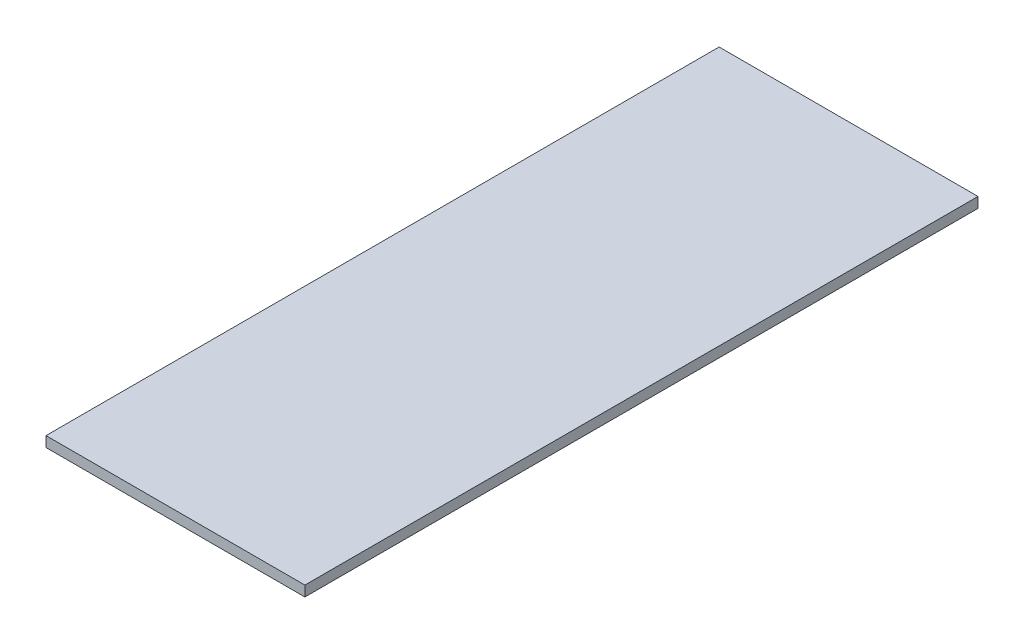
ISO-10303-21;
HEADER;
FILE_DESCRIPTION(('STEP AP214'),'2;1');
FILE_NAME('part.step','',(''),(''),'','','');
FILE_SCHEMA(('AUTOMOTIVE_DESIGN { 1 0 10303 214 1 1 1 1 }'));
ENDSEC;
DATA;
#1=APPLICATION_CONTEXT('core data for automotive mechanical design processes');
#2=APPLICATION_PROTOCOL_DEFINITION('international standard','automotive_design',2000,#1);
#3=PRODUCT_CONTEXT('',#1,'mechanical');
#4=PRODUCT('Part','Part','',(#3));
#5=PRODUCT_RELATED_PRODUCT_CATEGORY('part','',(#4));
#6=PRODUCT_DEFINITION_FORMATION('','',#4);
#7=PRODUCT_DEFINITION_CONTEXT('part definition',#1,'design');
#8=PRODUCT_DEFINITION('design','',#6,#7);
#9=PRODUCT_DEFINITION_SHAPE('','',#8);
#10=(LENGTH_UNIT() NAMED_UNIT(*) SI_UNIT(.MILLI.,.METRE.));
#11=(NAMED_UNIT(*) PLANE_ANGLE_UNIT() SI_UNIT($,.RADIAN.));
#12=(NAMED_UNIT(*) SI_UNIT($,.STERADIAN.) SOLID_ANGLE_UNIT());
#13=UNCERTAINTY_MEASURE_WITH_UNIT(LENGTH_MEASURE(1.E-05),#10,'distance_accuracy_value','');
#14=(GEOMETRIC_REPRESENTATION_CONTEXT(3) GLOBAL_UNCERTAINTY_ASSIGNED_CONTEXT((#13)) GLOBAL_UNIT_ASSIGNED_CONTEXT((#10,
#11,#12)) REPRESENTATION_CONTEXT('',''));
#15=CARTESIAN_POINT('',(0.,0.,0.));
#16=DIRECTION('',(0.,0.,1.));
#17=DIRECTION('',(1.,0.,0.));
#18=AXIS2_PLACEMENT_3D('',#15,#16,#17);
#19=CARTESIAN_POINT('',(-60.1189882717498,5.08,-244.255940418989));
#20=DIRECTION('',(1.,0.,0.));
#21=DIRECTION('',(0.,0.,-1.));
#22=AXIS2_PLACEMENT_3D('',#19,#20,#21);
#23=PLANE('',#22);
#24=DIRECTION('',(0.,0.,1.));
#25=VECTOR('',#24,1.);
#26=CARTESIAN_POINT('',(-60.1189882717498,0.,-244.255940418989));
#27=LINE('',#26,#25);
#28=CARTESIAN_POINT('',(-60.1189882717498,0.,-244.255940418989));
#29=VERTEX_POINT('',#28);
#30=CARTESIAN_POINT('',(-60.1189882717498,0.,85.9440595810113));
#31=VERTEX_POINT('',#30);
#32=EDGE_CURVE('E96',#29,#31,#27,.T.);
#33=ORIENTED_EDGE('',*,*,#32,.T.);
#34=DIRECTION('',(0.,-1.,0.));
#35=VECTOR('',#34,1.);
#36=CARTESIAN_POINT('',(-60.1189882717498,5.08,85.9440595810113));
#37=LINE('',#36,#35);
#38=CARTESIAN_POINT('',(-60.1189882717498,5.08,85.9440595810113));
#39=VERTEX_POINT('',#38);
#40=EDGE_CURVE('E11',#39,#31,#37,.T.);
#41=ORIENTED_EDGE('',*,*,#40,.F.);
#42=DIRECTION('',(0.,0.,1.));
#43=VECTOR('',#42,1.);
#44=CARTESIAN_POINT('',(-60.1189882717498,5.08,-244.255940418989));
#45=LINE('',#44,#43);
#46=CARTESIAN_POINT('',(-60.1189882717498,5.08,-244.255940418989));
#47=VERTEX_POINT('',#46);
#48=EDGE_CURVE('E84',#47,#39,#45,.T.);
#49=ORIENTED_EDGE('',*,*,#48,.F.);
#50=DIRECTION('',(0.,-1.,0.));
#51=VECTOR('',#50,1.);
#52=CARTESIAN_POINT('',(-60.1189882717498,5.08,-244.255940418989));
#53=LINE('',#52,#51);
#54=EDGE_CURVE('E92',#47,#29,#53,.T.);
#55=ORIENTED_EDGE('',*,*,#54,.T.);
#56=EDGE_LOOP('',(#33,#41,#49,#55));
#57=FACE_BOUND('',#56,.T.);
#58=ADVANCED_FACE('F33',(#57),#23,.F.);
#59=CARTESIAN_POINT('',(-60.1189882717498,5.08,85.9440595810113));
#60=DIRECTION('',(0.,0.,-1.));
#61=DIRECTION('',(-1.,0.,0.));
#62=AXIS2_PLACEMENT_3D('',#59,#60,#61);
#63=PLANE('',#62);
#64=DIRECTION('',(1.,0.,0.));
#65=VECTOR('',#64,1.);
#66=CARTESIAN_POINT('',(-60.1189882717498,0.,85.9440595810113));
#67=LINE('',#66,#65);
#68=CARTESIAN_POINT('',(66.8810117282502,0.,85.9440595810113));
#69=VERTEX_POINT('',#68);
#70=EDGE_CURVE('E88',#31,#69,#67,.T.);
#71=ORIENTED_EDGE('',*,*,#70,.T.);
#72=DIRECTION('',(0.,-1.,0.));
#73=VECTOR('',#72,1.);
#74=CARTESIAN_POINT('',(66.8810117282502,5.08,85.9440595810113));
#75=LINE('',#74,#73);
#76=CARTESIAN_POINT('',(66.8810117282502,5.08,85.9440595810113));
#77=VERTEX_POINT('',#76);
#78=EDGE_CURVE('E41',#77,#69,#75,.T.);
#79=ORIENTED_EDGE('',*,*,#78,.F.);
#80=DIRECTION('',(1.,0.,0.));
#81=VECTOR('',#80,1.);
#82=CARTESIAN_POINT('',(-60.1189882717498,5.08,85.9440595810113));
#83=LINE('',#82,#81);
#84=EDGE_CURVE('E79',#39,#77,#83,.T.);
#85=ORIENTED_EDGE('',*,*,#84,.F.);
#86=ORIENTED_EDGE('',*,*,#40,.T.);
#87=EDGE_LOOP('',(#71,#79,#85,#86));
#88=FACE_BOUND('',#87,.T.);
#89=ADVANCED_FACE('F87',(#88),#63,.F.);
#90=CARTESIAN_POINT('',(66.8810117282502,5.08,-244.255940418989));
#91=DIRECTION('',(-1.,0.,0.));
#92=DIRECTION('',(0.,0.,1.));
#93=AXIS2_PLACEMENT_3D('',#90,#91,#92);
#94=PLANE('',#93);
#95=DIRECTION('',(0.,0.,-1.));
#96=VECTOR('',#95,1.);
#97=CARTESIAN_POINT('',(66.8810117282502,0.,-244.255940418989));
#98=LINE('',#97,#96);
#99=CARTESIAN_POINT('',(66.8810117282502,0.,-244.255940418989));
#100=VERTEX_POINT('',#99);
#101=EDGE_CURVE('E66',#69,#100,#98,.T.);
#102=ORIENTED_EDGE('',*,*,#101,.T.);
#103=DIRECTION('',(0.,-1.,0.));
#104=VECTOR('',#103,1.);
#105=CARTESIAN_POINT('',(66.8810117282502,5.08,-244.255940418989));
#106=LINE('',#105,#104);
#107=CARTESIAN_POINT('',(66.8810117282502,5.08,-244.255940418989));
#108=VERTEX_POINT('',#107);
#109=EDGE_CURVE('E89',#108,#100,#106,.T.);
#110=ORIENTED_EDGE('',*,*,#109,.F.);
#111=DIRECTION('',(0.,0.,-1.));
#112=VECTOR('',#111,1.);
#113=CARTESIAN_POINT('',(66.8810117282502,5.08,-244.255940418989));
#114=LINE('',#113,#112);
#115=EDGE_CURVE('E82',#77,#108,#114,.T.);
#116=ORIENTED_EDGE('',*,*,#115,.F.);
#117=ORIENTED_EDGE('',*,*,#78,.T.);
#118=EDGE_LOOP('',(#102,#110,#116,#117));
#119=FACE_BOUND('',#118,.T.);
#120=ADVANCED_FACE('F90',(#119),#94,.F.);
#121=CARTESIAN_POINT('',(-60.1189882717498,5.08,-244.255940418989));
#122=DIRECTION('',(0.,0.,1.));
#123=DIRECTION('',(1.,0.,0.));
#124=AXIS2_PLACEMENT_3D('',#121,#122,#123);
#125=PLANE('',#124);
#126=DIRECTION('',(-1.,0.,0.));
#127=VECTOR('',#126,1.);
#128=CARTESIAN_POINT('',(-60.1189882717498,0.,-244.255940418989));
#129=LINE('',#128,#127);
#130=EDGE_CURVE('E72',#100,#29,#129,.T.);
#131=ORIENTED_EDGE('',*,*,#130,.T.);
#132=ORIENTED_EDGE('',*,*,#54,.F.);
#133=DIRECTION('',(-1.,0.,0.));
#134=VECTOR('',#133,1.);
#135=CARTESIAN_POINT('',(-60.1189882717498,5.08,-244.255940418989));
#136=LINE('',#135,#134);
#137=EDGE_CURVE('E49',#108,#47,#136,.T.);
#138=ORIENTED_EDGE('',*,*,#137,.F.);
#139=ORIENTED_EDGE('',*,*,#109,.T.);
#140=EDGE_LOOP('',(#131,#132,#138,#139));
#141=FACE_BOUND('',#140,.T.);
#142=ADVANCED_FACE('F103',(#141),#125,.F.);
#143=CARTESIAN_POINT('',(0.,5.08,0.));
#144=DIRECTION('',(0.,1.,0.));
#145=DIRECTION('',(0.,0.,1.));
#146=AXIS2_PLACEMENT_3D('',#143,#144,#145);
#147=PLANE('',#146);
#148=ORIENTED_EDGE('',*,*,#48,.T.);
#149=ORIENTED_EDGE('',*,*,#84,.T.);
#150=ORIENTED_EDGE('',*,*,#115,.T.);
#151=ORIENTED_EDGE('',*,*,#137,.T.);
#152=EDGE_LOOP('',(#148,#149,#150,#151));
#153=FACE_BOUND('',#152,.T.);
#154=ADVANCED_FACE('F80',(#153),#147,.T.);
#155=CARTESIAN_POINT('',(0.,0.,0.));
#156=DIRECTION('',(0.,1.,0.));
#157=DIRECTION('',(0.,0.,1.));
#158=AXIS2_PLACEMENT_3D('',#155,#156,#157);
#159=PLANE('',#158);
#160=ORIENTED_EDGE('',*,*,#32,.F.);
#161=ORIENTED_EDGE('',*,*,#130,.F.);
#162=ORIENTED_EDGE('',*,*,#101,.F.);
#163=ORIENTED_EDGE('',*,*,#70,.F.);
#164=EDGE_LOOP('',(#160,#161,#162,#163));
#165=FACE_BOUND('',#164,.T.);
#166=ADVANCED_FACE('F106',(#165),#159,.F.);
#167=CLOSED_SHELL('',(#58,#89,#120,#142,#154,#166));
#168=MANIFOLD_SOLID_BREP('B2',#167);
#169=ADVANCED_BREP_SHAPE_REPRESENTATION('',(#18,#168),#14);
#170=SHAPE_DEFINITION_REPRESENTATION(#9,#169);
ENDSEC;
END-ISO-10303-21;
